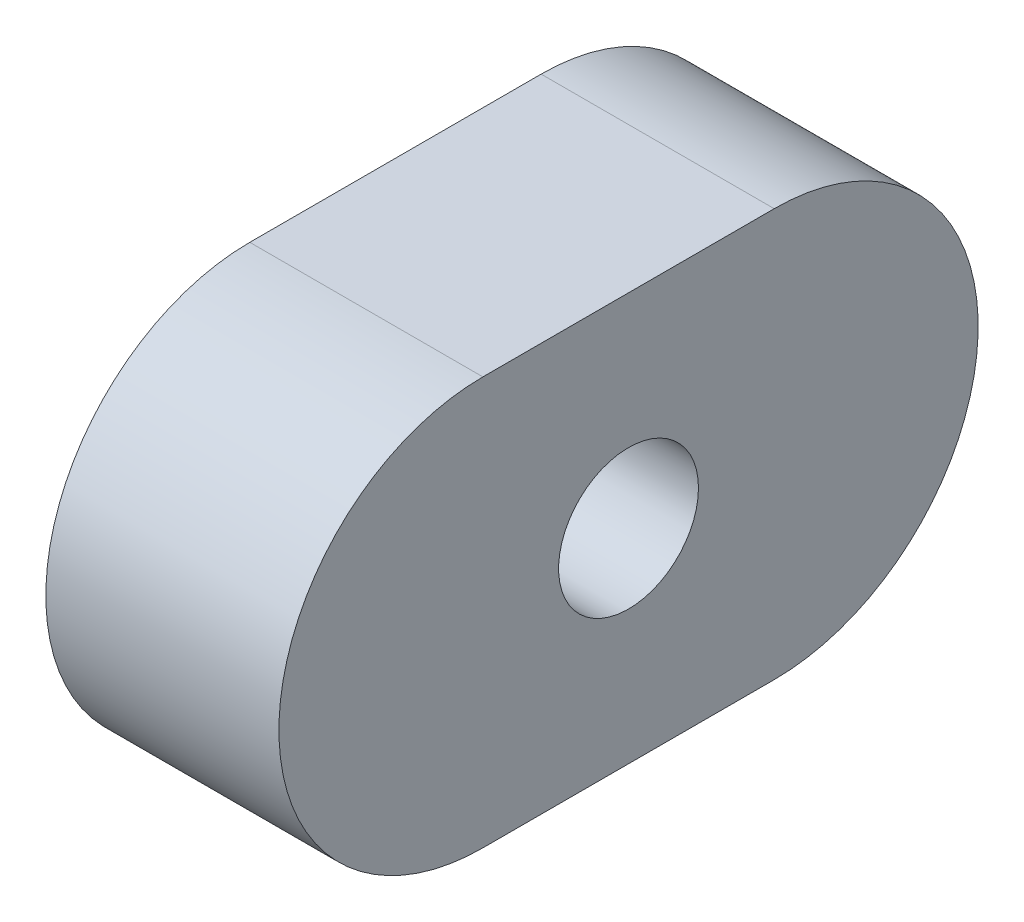
ISO-10303-21;
HEADER;
FILE_DESCRIPTION(('STEP AP214'),'2;1');
FILE_NAME('part.step','',(''),(''),'','','');
FILE_SCHEMA(('AUTOMOTIVE_DESIGN { 1 0 10303 214 1 1 1 1 }'));
ENDSEC;
DATA;
#1=APPLICATION_CONTEXT('core data for automotive mechanical design processes');
#2=APPLICATION_PROTOCOL_DEFINITION('international standard','automotive_design',2000,#1);
#3=PRODUCT_CONTEXT('',#1,'mechanical');
#4=PRODUCT('Part','Part','',(#3));
#5=PRODUCT_RELATED_PRODUCT_CATEGORY('part','',(#4));
#6=PRODUCT_DEFINITION_FORMATION('','',#4);
#7=PRODUCT_DEFINITION_CONTEXT('part definition',#1,'design');
#8=PRODUCT_DEFINITION('design','',#6,#7);
#9=PRODUCT_DEFINITION_SHAPE('','',#8);
#10=(LENGTH_UNIT() NAMED_UNIT(*) SI_UNIT(.MILLI.,.METRE.));
#11=(NAMED_UNIT(*) PLANE_ANGLE_UNIT() SI_UNIT($,.RADIAN.));
#12=(NAMED_UNIT(*) SI_UNIT($,.STERADIAN.) SOLID_ANGLE_UNIT());
#13=UNCERTAINTY_MEASURE_WITH_UNIT(LENGTH_MEASURE(1.E-05),#10,'distance_accuracy_value','');
#14=(GEOMETRIC_REPRESENTATION_CONTEXT(3) GLOBAL_UNCERTAINTY_ASSIGNED_CONTEXT((#13)) GLOBAL_UNIT_ASSIGNED_CONTEXT((#10,
#11,#12)) REPRESENTATION_CONTEXT('',''));
#15=CARTESIAN_POINT('',(0.,0.,0.));
#16=DIRECTION('',(0.,0.,1.));
#17=DIRECTION('',(1.,0.,0.));
#18=AXIS2_PLACEMENT_3D('',#15,#16,#17);
#19=CARTESIAN_POINT('',(10.,0.,-12.5));
#20=DIRECTION('',(1.,0.,0.));
#21=DIRECTION('',(0.,0.,-1.));
#22=AXIS2_PLACEMENT_3D('',#19,#20,#21);
#23=PLANE('',#22);
#24=CARTESIAN_POINT('',(10.,0.,-12.5));
#25=DIRECTION('',(1.,0.,0.));
#26=DIRECTION('',(0.,0.,-1.));
#27=AXIS2_PLACEMENT_3D('',#24,#25,#26);
#28=CIRCLE('',#27,17.5);
#29=CARTESIAN_POINT('',(10.,-17.5,-12.5));
#30=VERTEX_POINT('',#29);
#31=CARTESIAN_POINT('',(10.,17.5,-12.5));
#32=VERTEX_POINT('',#31);
#33=EDGE_CURVE('E97',#30,#32,#28,.T.);
#34=ORIENTED_EDGE('',*,*,#33,.T.);
#35=DIRECTION('',(0.,0.,1.));
#36=VECTOR('',#35,1.);
#37=CARTESIAN_POINT('',(10.,17.5,-12.5));
#38=LINE('',#37,#36);
#39=CARTESIAN_POINT('',(10.,17.5,12.5));
#40=VERTEX_POINT('',#39);
#41=EDGE_CURVE('E93',#32,#40,#38,.T.);
#42=ORIENTED_EDGE('',*,*,#41,.T.);
#43=CARTESIAN_POINT('',(10.,0.,12.5));
#44=DIRECTION('',(1.,0.,0.));
#45=DIRECTION('',(0.,0.,-1.));
#46=AXIS2_PLACEMENT_3D('',#43,#44,#45);
#47=CIRCLE('',#46,17.5);
#48=CARTESIAN_POINT('',(10.,-17.5,12.5));
#49=VERTEX_POINT('',#48);
#50=EDGE_CURVE('E96',#40,#49,#47,.T.);
#51=ORIENTED_EDGE('',*,*,#50,.T.);
#52=DIRECTION('',(0.,0.,-1.));
#53=VECTOR('',#52,1.);
#54=CARTESIAN_POINT('',(10.,-17.5,-12.5));
#55=LINE('',#54,#53);
#56=EDGE_CURVE('E65',#49,#30,#55,.T.);
#57=ORIENTED_EDGE('',*,*,#56,.T.);
#58=EDGE_LOOP('',(#34,#42,#51,#57));
#59=FACE_BOUND('',#58,.T.);
#60=CARTESIAN_POINT('',(10.,0.,0.));
#61=DIRECTION('',(1.,0.,0.));
#62=DIRECTION('',(0.,0.,-1.));
#63=AXIS2_PLACEMENT_3D('',#60,#61,#62);
#64=CIRCLE('',#63,6.);
#65=CARTESIAN_POINT('',(10.,0.,-6.));
#66=VERTEX_POINT('',#65);
#67=EDGE_CURVE('E120',#66,#66,#64,.T.);
#68=ORIENTED_EDGE('',*,*,#67,.F.);
#69=EDGE_LOOP('',(#68));
#70=FACE_BOUND('',#69,.T.);
#71=ADVANCED_FACE('F44',(#59,#70),#23,.T.);
#72=CARTESIAN_POINT('',(-10.,0.,-12.5));
#73=DIRECTION('',(1.,0.,0.));
#74=DIRECTION('',(0.,0.,-1.));
#75=AXIS2_PLACEMENT_3D('',#72,#73,#74);
#76=PLANE('',#75);
#77=CARTESIAN_POINT('',(-10.,0.,-12.5));
#78=DIRECTION('',(1.,0.,0.));
#79=DIRECTION('',(0.,0.,-1.));
#80=AXIS2_PLACEMENT_3D('',#77,#78,#79);
#81=CIRCLE('',#80,17.5);
#82=CARTESIAN_POINT('',(-10.,-17.5,-12.5));
#83=VERTEX_POINT('',#82);
#84=CARTESIAN_POINT('',(-10.,17.5,-12.5));
#85=VERTEX_POINT('',#84);
#86=EDGE_CURVE('E114',#83,#85,#81,.T.);
#87=ORIENTED_EDGE('',*,*,#86,.F.);
#88=DIRECTION('',(0.,0.,-1.));
#89=VECTOR('',#88,1.);
#90=CARTESIAN_POINT('',(-10.,-17.5,-12.5));
#91=LINE('',#90,#89);
#92=CARTESIAN_POINT('',(-10.,-17.5,12.5));
#93=VERTEX_POINT('',#92);
#94=EDGE_CURVE('E86',#93,#83,#91,.T.);
#95=ORIENTED_EDGE('',*,*,#94,.F.);
#96=CARTESIAN_POINT('',(-10.,0.,12.5));
#97=DIRECTION('',(1.,0.,0.));
#98=DIRECTION('',(0.,0.,-1.));
#99=AXIS2_PLACEMENT_3D('',#96,#97,#98);
#100=CIRCLE('',#99,17.5);
#101=CARTESIAN_POINT('',(-10.,17.5,12.5));
#102=VERTEX_POINT('',#101);
#103=EDGE_CURVE('E79',#102,#93,#100,.T.);
#104=ORIENTED_EDGE('',*,*,#103,.F.);
#105=DIRECTION('',(0.,0.,1.));
#106=VECTOR('',#105,1.);
#107=CARTESIAN_POINT('',(-10.,17.5,-12.5));
#108=LINE('',#107,#106);
#109=EDGE_CURVE('E104',#85,#102,#108,.T.);
#110=ORIENTED_EDGE('',*,*,#109,.F.);
#111=EDGE_LOOP('',(#87,#95,#104,#110));
#112=FACE_BOUND('',#111,.T.);
#113=CARTESIAN_POINT('',(-10.,0.,0.));
#114=DIRECTION('',(1.,0.,0.));
#115=DIRECTION('',(0.,0.,-1.));
#116=AXIS2_PLACEMENT_3D('',#113,#114,#115);
#117=CIRCLE('',#116,6.);
#118=CARTESIAN_POINT('',(-10.,0.,-6.));
#119=VERTEX_POINT('',#118);
#120=EDGE_CURVE('E136',#119,#119,#117,.T.);
#121=ORIENTED_EDGE('',*,*,#120,.T.);
#122=EDGE_LOOP('',(#121));
#123=FACE_BOUND('',#122,.T.);
#124=ADVANCED_FACE('F131',(#112,#123),#76,.F.);
#125=CARTESIAN_POINT('',(10.,0.,-12.5));
#126=DIRECTION('',(-1.,0.,0.));
#127=DIRECTION('',(0.,0.,1.));
#128=AXIS2_PLACEMENT_3D('',#125,#126,#127);
#129=CYLINDRICAL_SURFACE('',#128,17.5);
#130=ORIENTED_EDGE('',*,*,#86,.T.);
#131=DIRECTION('',(-1.,0.,0.));
#132=VECTOR('',#131,1.);
#133=CARTESIAN_POINT('',(10.,17.5,-12.5));
#134=LINE('',#133,#132);
#135=EDGE_CURVE('E11',#32,#85,#134,.T.);
#136=ORIENTED_EDGE('',*,*,#135,.F.);
#137=ORIENTED_EDGE('',*,*,#33,.F.);
#138=DIRECTION('',(-1.,0.,0.));
#139=VECTOR('',#138,1.);
#140=CARTESIAN_POINT('',(10.,-17.5,-12.5));
#141=LINE('',#140,#139);
#142=EDGE_CURVE('E108',#30,#83,#141,.T.);
#143=ORIENTED_EDGE('',*,*,#142,.T.);
#144=EDGE_LOOP('',(#130,#136,#137,#143));
#145=FACE_BOUND('',#144,.T.);
#146=ADVANCED_FACE('F50',(#145),#129,.T.);
#147=CARTESIAN_POINT('',(10.,17.5,-12.5));
#148=DIRECTION('',(0.,-1.,0.));
#149=DIRECTION('',(0.,0.,-1.));
#150=AXIS2_PLACEMENT_3D('',#147,#148,#149);
#151=PLANE('',#150);
#152=ORIENTED_EDGE('',*,*,#109,.T.);
#153=DIRECTION('',(-1.,0.,0.));
#154=VECTOR('',#153,1.);
#155=CARTESIAN_POINT('',(10.,17.5,12.5));
#156=LINE('',#155,#154);
#157=EDGE_CURVE('E54',#40,#102,#156,.T.);
#158=ORIENTED_EDGE('',*,*,#157,.F.);
#159=ORIENTED_EDGE('',*,*,#41,.F.);
#160=ORIENTED_EDGE('',*,*,#135,.T.);
#161=EDGE_LOOP('',(#152,#158,#159,#160));
#162=FACE_BOUND('',#161,.T.);
#163=ADVANCED_FACE('F105',(#162),#151,.F.);
#164=CARTESIAN_POINT('',(10.,0.,12.5));
#165=DIRECTION('',(-1.,0.,0.));
#166=DIRECTION('',(0.,0.,1.));
#167=AXIS2_PLACEMENT_3D('',#164,#165,#166);
#168=CYLINDRICAL_SURFACE('',#167,17.5);
#169=ORIENTED_EDGE('',*,*,#103,.T.);
#170=DIRECTION('',(-1.,0.,0.));
#171=VECTOR('',#170,1.);
#172=CARTESIAN_POINT('',(10.,-17.5,12.5));
#173=LINE('',#172,#171);
#174=EDGE_CURVE('E103',#49,#93,#173,.T.);
#175=ORIENTED_EDGE('',*,*,#174,.F.);
#176=ORIENTED_EDGE('',*,*,#50,.F.);
#177=ORIENTED_EDGE('',*,*,#157,.T.);
#178=EDGE_LOOP('',(#169,#175,#176,#177));
#179=FACE_BOUND('',#178,.T.);
#180=ADVANCED_FACE('F107',(#179),#168,.T.);
#181=CARTESIAN_POINT('',(10.,-17.5,-12.5));
#182=DIRECTION('',(0.,1.,0.));
#183=DIRECTION('',(0.,0.,1.));
#184=AXIS2_PLACEMENT_3D('',#181,#182,#183);
#185=PLANE('',#184);
#186=ORIENTED_EDGE('',*,*,#94,.T.);
#187=ORIENTED_EDGE('',*,*,#142,.F.);
#188=ORIENTED_EDGE('',*,*,#56,.F.);
#189=ORIENTED_EDGE('',*,*,#174,.T.);
#190=EDGE_LOOP('',(#186,#187,#188,#189));
#191=FACE_BOUND('',#190,.T.);
#192=ADVANCED_FACE('F126',(#191),#185,.F.);
#193=CARTESIAN_POINT('',(10.,0.,0.));
#194=DIRECTION('',(-1.,0.,0.));
#195=DIRECTION('',(0.,0.,1.));
#196=AXIS2_PLACEMENT_3D('',#193,#194,#195);
#197=CYLINDRICAL_SURFACE('',#196,6.);
#198=ORIENTED_EDGE('',*,*,#67,.T.);
#199=EDGE_LOOP('',(#198));
#200=FACE_BOUND('',#199,.T.);
#201=ORIENTED_EDGE('',*,*,#120,.F.);
#202=EDGE_LOOP('',(#201));
#203=FACE_BOUND('',#202,.T.);
#204=ADVANCED_FACE('F143',(#200,#203),#197,.F.);
#205=CLOSED_SHELL('',(#71,#124,#146,#163,#180,#192,#204));
#206=MANIFOLD_SOLID_BREP('B2',#205);
#207=ADVANCED_BREP_SHAPE_REPRESENTATION('',(#18,#206),#14);
#208=SHAPE_DEFINITION_REPRESENTATION(#9,#207);
ENDSEC;
END-ISO-10303-21;
